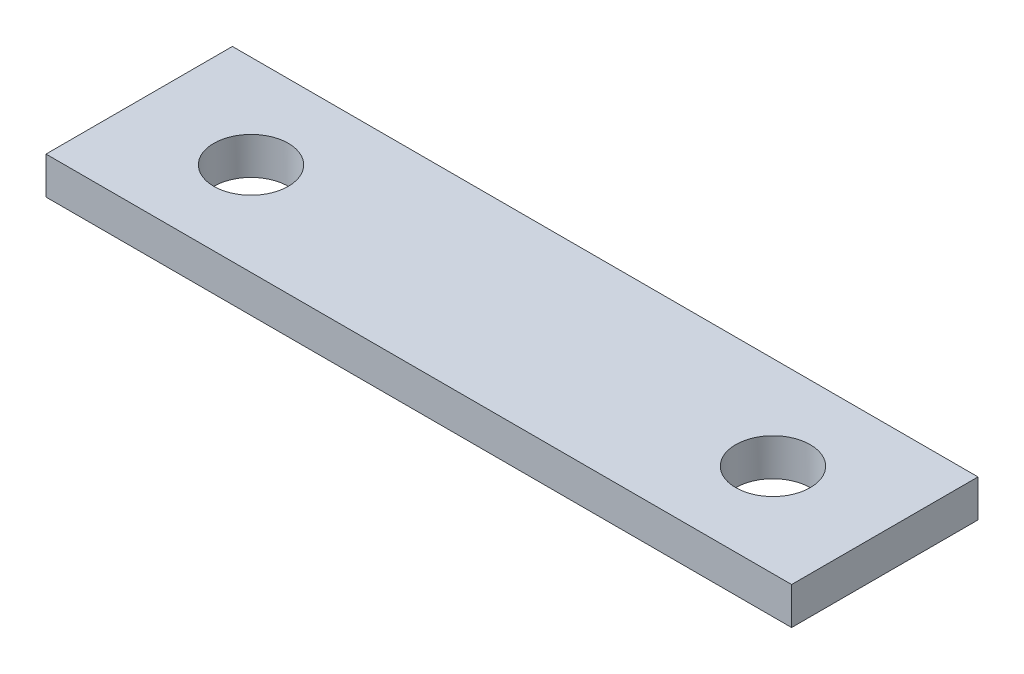
ISO-10303-21;
HEADER;
FILE_DESCRIPTION(('STEP AP214'),'2;1');
FILE_NAME('part.step','',(''),(''),'','','');
FILE_SCHEMA(('AUTOMOTIVE_DESIGN { 1 0 10303 214 1 1 1 1 }'));
ENDSEC;
DATA;
#1=APPLICATION_CONTEXT('core data for automotive mechanical design processes');
#2=APPLICATION_PROTOCOL_DEFINITION('international standard','automotive_design',2000,#1);
#3=PRODUCT_CONTEXT('',#1,'mechanical');
#4=PRODUCT('Part','Part','',(#3));
#5=PRODUCT_RELATED_PRODUCT_CATEGORY('part','',(#4));
#6=PRODUCT_DEFINITION_FORMATION('','',#4);
#7=PRODUCT_DEFINITION_CONTEXT('part definition',#1,'design');
#8=PRODUCT_DEFINITION('design','',#6,#7);
#9=PRODUCT_DEFINITION_SHAPE('','',#8);
#10=(LENGTH_UNIT() NAMED_UNIT(*) SI_UNIT(.MILLI.,.METRE.));
#11=(NAMED_UNIT(*) PLANE_ANGLE_UNIT() SI_UNIT($,.RADIAN.));
#12=(NAMED_UNIT(*) SI_UNIT($,.STERADIAN.) SOLID_ANGLE_UNIT());
#13=UNCERTAINTY_MEASURE_WITH_UNIT(LENGTH_MEASURE(1.E-05),#10,'distance_accuracy_value','');
#14=(GEOMETRIC_REPRESENTATION_CONTEXT(3) GLOBAL_UNCERTAINTY_ASSIGNED_CONTEXT((#13)) GLOBAL_UNIT_ASSIGNED_CONTEXT((#10,
#11,#12)) REPRESENTATION_CONTEXT('',''));
#15=CARTESIAN_POINT('',(0.,0.,0.));
#16=DIRECTION('',(0.,0.,1.));
#17=DIRECTION('',(1.,0.,0.));
#18=AXIS2_PLACEMENT_3D('',#15,#16,#17);
#19=CARTESIAN_POINT('',(4.99999999999999,0.5,1.25));
#20=DIRECTION('',(-1.,0.,0.));
#21=DIRECTION('',(0.,0.,1.));
#22=AXIS2_PLACEMENT_3D('',#19,#20,#21);
#23=PLANE('',#22);
#24=DIRECTION('',(0.,0.,-1.));
#25=VECTOR('',#24,1.);
#26=CARTESIAN_POINT('',(4.99999999999999,0.,1.25));
#27=LINE('',#26,#25);
#28=CARTESIAN_POINT('',(4.99999999999999,0.,1.25));
#29=VERTEX_POINT('',#28);
#30=CARTESIAN_POINT('',(4.99999999999999,0.,-1.25));
#31=VERTEX_POINT('',#30);
#32=EDGE_CURVE('E107',#29,#31,#27,.T.);
#33=ORIENTED_EDGE('',*,*,#32,.T.);
#34=DIRECTION('',(0.,-1.,0.));
#35=VECTOR('',#34,1.);
#36=CARTESIAN_POINT('',(4.99999999999999,0.5,-1.25));
#37=LINE('',#36,#35);
#38=CARTESIAN_POINT('',(4.99999999999999,0.5,-1.25));
#39=VERTEX_POINT('',#38);
#40=EDGE_CURVE('E11',#39,#31,#37,.T.);
#41=ORIENTED_EDGE('',*,*,#40,.F.);
#42=DIRECTION('',(0.,0.,-1.));
#43=VECTOR('',#42,1.);
#44=CARTESIAN_POINT('',(4.99999999999999,0.5,1.25));
#45=LINE('',#44,#43);
#46=CARTESIAN_POINT('',(4.99999999999999,0.5,1.25));
#47=VERTEX_POINT('',#46);
#48=EDGE_CURVE('E91',#47,#39,#45,.T.);
#49=ORIENTED_EDGE('',*,*,#48,.F.);
#50=DIRECTION('',(0.,-1.,0.));
#51=VECTOR('',#50,1.);
#52=CARTESIAN_POINT('',(4.99999999999999,0.5,1.25));
#53=LINE('',#52,#51);
#54=EDGE_CURVE('E103',#47,#29,#53,.T.);
#55=ORIENTED_EDGE('',*,*,#54,.T.);
#56=EDGE_LOOP('',(#33,#41,#49,#55));
#57=FACE_BOUND('',#56,.T.);
#58=ADVANCED_FACE('F39',(#57),#23,.F.);
#59=CARTESIAN_POINT('',(-5.,0.5,-1.25));
#60=DIRECTION('',(0.,0.,1.));
#61=DIRECTION('',(1.,0.,0.));
#62=AXIS2_PLACEMENT_3D('',#59,#60,#61);
#63=PLANE('',#62);
#64=DIRECTION('',(-1.,0.,0.));
#65=VECTOR('',#64,1.);
#66=CARTESIAN_POINT('',(-5.,0.,-1.25));
#67=LINE('',#66,#65);
#68=CARTESIAN_POINT('',(-5.,0.,-1.25));
#69=VERTEX_POINT('',#68);
#70=EDGE_CURVE('E96',#31,#69,#67,.T.);
#71=ORIENTED_EDGE('',*,*,#70,.T.);
#72=DIRECTION('',(0.,-1.,0.));
#73=VECTOR('',#72,1.);
#74=CARTESIAN_POINT('',(-5.,0.5,-1.25));
#75=LINE('',#74,#73);
#76=CARTESIAN_POINT('',(-5.,0.5,-1.25));
#77=VERTEX_POINT('',#76);
#78=EDGE_CURVE('E48',#77,#69,#75,.T.);
#79=ORIENTED_EDGE('',*,*,#78,.F.);
#80=DIRECTION('',(-1.,0.,0.));
#81=VECTOR('',#80,1.);
#82=CARTESIAN_POINT('',(-5.,0.5,-1.25));
#83=LINE('',#82,#81);
#84=EDGE_CURVE('E86',#39,#77,#83,.T.);
#85=ORIENTED_EDGE('',*,*,#84,.F.);
#86=ORIENTED_EDGE('',*,*,#40,.T.);
#87=EDGE_LOOP('',(#71,#79,#85,#86));
#88=FACE_BOUND('',#87,.T.);
#89=ADVANCED_FACE('F95',(#88),#63,.F.);
#90=CARTESIAN_POINT('',(-5.,0.5,1.25));
#91=DIRECTION('',(1.,0.,0.));
#92=DIRECTION('',(0.,0.,-1.));
#93=AXIS2_PLACEMENT_3D('',#90,#91,#92);
#94=PLANE('',#93);
#95=DIRECTION('',(0.,0.,1.));
#96=VECTOR('',#95,1.);
#97=CARTESIAN_POINT('',(-5.,0.,1.25));
#98=LINE('',#97,#96);
#99=CARTESIAN_POINT('',(-5.,0.,1.25));
#100=VERTEX_POINT('',#99);
#101=EDGE_CURVE('E73',#69,#100,#98,.T.);
#102=ORIENTED_EDGE('',*,*,#101,.T.);
#103=DIRECTION('',(0.,-1.,0.));
#104=VECTOR('',#103,1.);
#105=CARTESIAN_POINT('',(-5.,0.5,1.25));
#106=LINE('',#105,#104);
#107=CARTESIAN_POINT('',(-5.,0.5,1.25));
#108=VERTEX_POINT('',#107);
#109=EDGE_CURVE('E98',#108,#100,#106,.T.);
#110=ORIENTED_EDGE('',*,*,#109,.F.);
#111=DIRECTION('',(0.,0.,1.));
#112=VECTOR('',#111,1.);
#113=CARTESIAN_POINT('',(-5.,0.5,1.25));
#114=LINE('',#113,#112);
#115=EDGE_CURVE('E89',#77,#108,#114,.T.);
#116=ORIENTED_EDGE('',*,*,#115,.F.);
#117=ORIENTED_EDGE('',*,*,#78,.T.);
#118=EDGE_LOOP('',(#102,#110,#116,#117));
#119=FACE_BOUND('',#118,.T.);
#120=ADVANCED_FACE('F99',(#119),#94,.F.);
#121=CARTESIAN_POINT('',(-5.,0.5,1.25));
#122=DIRECTION('',(0.,0.,-1.));
#123=DIRECTION('',(-1.,0.,0.));
#124=AXIS2_PLACEMENT_3D('',#121,#122,#123);
#125=PLANE('',#124);
#126=DIRECTION('',(1.,0.,0.));
#127=VECTOR('',#126,1.);
#128=CARTESIAN_POINT('',(-5.,0.,1.25));
#129=LINE('',#128,#127);
#130=EDGE_CURVE('E79',#100,#29,#129,.T.);
#131=ORIENTED_EDGE('',*,*,#130,.T.);
#132=ORIENTED_EDGE('',*,*,#54,.F.);
#133=DIRECTION('',(1.,0.,0.));
#134=VECTOR('',#133,1.);
#135=CARTESIAN_POINT('',(-5.,0.5,1.25));
#136=LINE('',#135,#134);
#137=EDGE_CURVE('E56',#108,#47,#136,.T.);
#138=ORIENTED_EDGE('',*,*,#137,.F.);
#139=ORIENTED_EDGE('',*,*,#109,.T.);
#140=EDGE_LOOP('',(#131,#132,#138,#139));
#141=FACE_BOUND('',#140,.T.);
#142=ADVANCED_FACE('F121',(#141),#125,.F.);
#143=CARTESIAN_POINT('',(0.,0.5,0.));
#144=DIRECTION('',(0.,-1.,0.));
#145=DIRECTION('',(0.,0.,-1.));
#146=AXIS2_PLACEMENT_3D('',#143,#144,#145);
#147=PLANE('',#146);
#148=CARTESIAN_POINT('',(-3.5,0.5,0.));
#149=DIRECTION('',(0.,-1.,0.));
#150=DIRECTION('',(0.,0.,-1.));
#151=AXIS2_PLACEMENT_3D('',#148,#149,#150);
#152=CIRCLE('',#151,0.499999999999999);
#153=CARTESIAN_POINT('',(-3.5,0.5,-0.499999999999999));
#154=VERTEX_POINT('',#153);
#155=EDGE_CURVE('E111',#154,#154,#152,.T.);
#156=ORIENTED_EDGE('',*,*,#155,.T.);
#157=EDGE_LOOP('',(#156));
#158=FACE_BOUND('',#157,.T.);
#159=CARTESIAN_POINT('',(3.5,0.5,0.));
#160=DIRECTION('',(0.,-1.,0.));
#161=DIRECTION('',(0.,0.,-1.));
#162=AXIS2_PLACEMENT_3D('',#159,#160,#161);
#163=CIRCLE('',#162,0.500000000000001);
#164=CARTESIAN_POINT('',(3.5,0.5,-0.500000000000001));
#165=VERTEX_POINT('',#164);
#166=EDGE_CURVE('E131',#165,#165,#163,.T.);
#167=ORIENTED_EDGE('',*,*,#166,.T.);
#168=EDGE_LOOP('',(#167));
#169=FACE_BOUND('',#168,.T.);
#170=ORIENTED_EDGE('',*,*,#48,.T.);
#171=ORIENTED_EDGE('',*,*,#84,.T.);
#172=ORIENTED_EDGE('',*,*,#115,.T.);
#173=ORIENTED_EDGE('',*,*,#137,.T.);
#174=EDGE_LOOP('',(#170,#171,#172,#173));
#175=FACE_BOUND('',#174,.T.);
#176=ADVANCED_FACE('F87',(#158,#169,#175),#147,.F.);
#177=CARTESIAN_POINT('',(0.,0.,0.));
#178=DIRECTION('',(0.,-1.,0.));
#179=DIRECTION('',(0.,0.,-1.));
#180=AXIS2_PLACEMENT_3D('',#177,#178,#179);
#181=PLANE('',#180);
#182=CARTESIAN_POINT('',(-3.5,0.,0.));
#183=DIRECTION('',(0.,1.,0.));
#184=DIRECTION('',(0.,0.,1.));
#185=AXIS2_PLACEMENT_3D('',#182,#183,#184);
#186=CIRCLE('',#185,0.499999999999999);
#187=CARTESIAN_POINT('',(-3.5,0.,0.499999999999999));
#188=VERTEX_POINT('',#187);
#189=EDGE_CURVE('E135',#188,#188,#186,.T.);
#190=ORIENTED_EDGE('',*,*,#189,.T.);
#191=EDGE_LOOP('',(#190));
#192=FACE_BOUND('',#191,.T.);
#193=CARTESIAN_POINT('',(3.5,0.,0.));
#194=DIRECTION('',(0.,1.,0.));
#195=DIRECTION('',(0.,0.,1.));
#196=AXIS2_PLACEMENT_3D('',#193,#194,#195);
#197=CIRCLE('',#196,0.500000000000001);
#198=CARTESIAN_POINT('',(3.5,0.,0.500000000000001));
#199=VERTEX_POINT('',#198);
#200=EDGE_CURVE('E136',#199,#199,#197,.T.);
#201=ORIENTED_EDGE('',*,*,#200,.T.);
#202=EDGE_LOOP('',(#201));
#203=FACE_BOUND('',#202,.T.);
#204=ORIENTED_EDGE('',*,*,#32,.F.);
#205=ORIENTED_EDGE('',*,*,#130,.F.);
#206=ORIENTED_EDGE('',*,*,#101,.F.);
#207=ORIENTED_EDGE('',*,*,#70,.F.);
#208=EDGE_LOOP('',(#204,#205,#206,#207));
#209=FACE_BOUND('',#208,.T.);
#210=ADVANCED_FACE('F124',(#192,#203,#209),#181,.T.);
#211=CARTESIAN_POINT('',(3.5,0.,0.));
#212=DIRECTION('',(0.,1.,0.));
#213=DIRECTION('',(0.,0.,1.));
#214=AXIS2_PLACEMENT_3D('',#211,#212,#213);
#215=CYLINDRICAL_SURFACE('',#214,0.500000000000001);
#216=ORIENTED_EDGE('',*,*,#200,.F.);
#217=EDGE_LOOP('',(#216));
#218=FACE_BOUND('',#217,.T.);
#219=ORIENTED_EDGE('',*,*,#166,.F.);
#220=EDGE_LOOP('',(#219));
#221=FACE_BOUND('',#220,.T.);
#222=ADVANCED_FACE('F149',(#218,#221),#215,.F.);
#223=CARTESIAN_POINT('',(-3.5,0.,0.));
#224=DIRECTION('',(0.,1.,0.));
#225=DIRECTION('',(0.,0.,1.));
#226=AXIS2_PLACEMENT_3D('',#223,#224,#225);
#227=CYLINDRICAL_SURFACE('',#226,0.499999999999999);
#228=ORIENTED_EDGE('',*,*,#189,.F.);
#229=EDGE_LOOP('',(#228));
#230=FACE_BOUND('',#229,.T.);
#231=ORIENTED_EDGE('',*,*,#155,.F.);
#232=EDGE_LOOP('',(#231));
#233=FACE_BOUND('',#232,.T.);
#234=ADVANCED_FACE('F146',(#230,#233),#227,.F.);
#235=CLOSED_SHELL('',(#58,#89,#120,#142,#176,#210,#222,#234));
#236=MANIFOLD_SOLID_BREP('B2',#235);
#237=ADVANCED_BREP_SHAPE_REPRESENTATION('',(#18,#236),#14);
#238=SHAPE_DEFINITION_REPRESENTATION(#9,#237);
ENDSEC;
END-ISO-10303-21;
